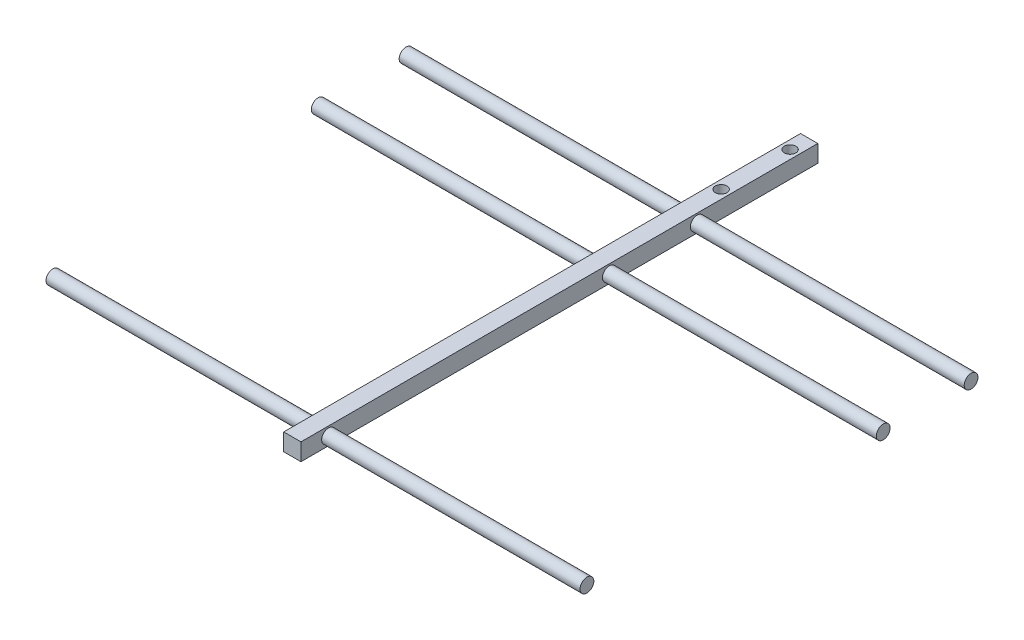
ISO-10303-21;
HEADER;
FILE_DESCRIPTION(('STEP AP214'),'2;1');
FILE_NAME('part.step','',(''),(''),'','','');
FILE_SCHEMA(('AUTOMOTIVE_DESIGN { 1 0 10303 214 1 1 1 1 }'));
ENDSEC;
DATA;
#1=APPLICATION_CONTEXT('core data for automotive mechanical design processes');
#2=APPLICATION_PROTOCOL_DEFINITION('international standard','automotive_design',2000,#1);
#3=PRODUCT_CONTEXT('',#1,'mechanical');
#4=PRODUCT('Part','Part','',(#3));
#5=PRODUCT_RELATED_PRODUCT_CATEGORY('part','',(#4));
#6=PRODUCT_DEFINITION_FORMATION('','',#4);
#7=PRODUCT_DEFINITION_CONTEXT('part definition',#1,'design');
#8=PRODUCT_DEFINITION('design','',#6,#7);
#9=PRODUCT_DEFINITION_SHAPE('','',#8);
#10=(LENGTH_UNIT() NAMED_UNIT(*) SI_UNIT(.MILLI.,.METRE.));
#11=(NAMED_UNIT(*) PLANE_ANGLE_UNIT() SI_UNIT($,.RADIAN.));
#12=(NAMED_UNIT(*) SI_UNIT($,.STERADIAN.) SOLID_ANGLE_UNIT());
#13=UNCERTAINTY_MEASURE_WITH_UNIT(LENGTH_MEASURE(1.E-05),#10,'distance_accuracy_value','');
#14=(GEOMETRIC_REPRESENTATION_CONTEXT(3) GLOBAL_UNCERTAINTY_ASSIGNED_CONTEXT((#13)) GLOBAL_UNIT_ASSIGNED_CONTEXT((#10,
#11,#12)) REPRESENTATION_CONTEXT('',''));
#15=CARTESIAN_POINT('',(0.,0.,0.));
#16=DIRECTION('',(0.,0.,1.));
#17=DIRECTION('',(1.,0.,0.));
#18=AXIS2_PLACEMENT_3D('',#15,#16,#17);
#19=CARTESIAN_POINT('',(5.,5.,300.));
#20=DIRECTION('',(-1.,0.,0.));
#21=DIRECTION('',(0.,-1.,0.));
#22=AXIS2_PLACEMENT_3D('',#19,#20,#21);
#23=PLANE('',#22);
#24=CARTESIAN_POINT('',(5.,0.,121.));
#25=DIRECTION('',(-1.,0.,0.));
#26=DIRECTION('',(0.,-1.,0.));
#27=AXIS2_PLACEMENT_3D('',#24,#25,#26);
#28=CIRCLE('',#27,3.99999999999999);
#29=CARTESIAN_POINT('',(5.,-3.99999999999999,121.));
#30=VERTEX_POINT('',#29);
#31=EDGE_CURVE('E171',#30,#30,#28,.T.);
#32=ORIENTED_EDGE('',*,*,#31,.T.);
#33=EDGE_LOOP('',(#32));
#34=FACE_BOUND('',#33,.T.);
#35=CARTESIAN_POINT('',(5.,0.,70.));
#36=DIRECTION('',(-1.,0.,0.));
#37=DIRECTION('',(0.,-1.,0.));
#38=AXIS2_PLACEMENT_3D('',#35,#36,#37);
#39=CIRCLE('',#38,3.99999999999999);
#40=CARTESIAN_POINT('',(5.,-3.99999999999999,70.));
#41=VERTEX_POINT('',#40);
#42=EDGE_CURVE('E157',#41,#41,#39,.T.);
#43=ORIENTED_EDGE('',*,*,#42,.T.);
#44=EDGE_LOOP('',(#43));
#45=FACE_BOUND('',#44,.T.);
#46=CARTESIAN_POINT('',(5.,0.,284.));
#47=DIRECTION('',(-1.,0.,0.));
#48=DIRECTION('',(0.,-1.,0.));
#49=AXIS2_PLACEMENT_3D('',#46,#47,#48);
#50=CIRCLE('',#49,3.99999999999999);
#51=CARTESIAN_POINT('',(5.,-3.99999999999999,284.));
#52=VERTEX_POINT('',#51);
#53=EDGE_CURVE('E152',#52,#52,#50,.T.);
#54=ORIENTED_EDGE('',*,*,#53,.T.);
#55=EDGE_LOOP('',(#54));
#56=FACE_BOUND('',#55,.T.);
#57=DIRECTION('',(0.,1.,0.));
#58=VECTOR('',#57,1.);
#59=CARTESIAN_POINT('',(5.,5.,0.));
#60=LINE('',#59,#58);
#61=CARTESIAN_POINT('',(5.,-5.,0.));
#62=VERTEX_POINT('',#61);
#63=CARTESIAN_POINT('',(5.,5.,0.));
#64=VERTEX_POINT('',#63);
#65=EDGE_CURVE('E139',#62,#64,#60,.T.);
#66=ORIENTED_EDGE('',*,*,#65,.T.);
#67=DIRECTION('',(0.,0.,-1.));
#68=VECTOR('',#67,1.);
#69=CARTESIAN_POINT('',(5.,5.,300.));
#70=LINE('',#69,#68);
#71=CARTESIAN_POINT('',(5.,5.,300.));
#72=VERTEX_POINT('',#71);
#73=EDGE_CURVE('E12',#72,#64,#70,.T.);
#74=ORIENTED_EDGE('',*,*,#73,.F.);
#75=DIRECTION('',(0.,1.,0.));
#76=VECTOR('',#75,1.);
#77=CARTESIAN_POINT('',(5.,5.,300.));
#78=LINE('',#77,#76);
#79=CARTESIAN_POINT('',(5.,-5.,300.));
#80=VERTEX_POINT('',#79);
#81=EDGE_CURVE('E122',#80,#72,#78,.T.);
#82=ORIENTED_EDGE('',*,*,#81,.F.);
#83=DIRECTION('',(0.,0.,-1.));
#84=VECTOR('',#83,1.);
#85=CARTESIAN_POINT('',(5.,-5.,300.));
#86=LINE('',#85,#84);
#87=EDGE_CURVE('E135',#80,#62,#86,.T.);
#88=ORIENTED_EDGE('',*,*,#87,.T.);
#89=EDGE_LOOP('',(#66,#74,#82,#88));
#90=FACE_BOUND('',#89,.T.);
#91=ADVANCED_FACE('F67',(#34,#45,#56,#90),#23,.F.);
#92=CARTESIAN_POINT('',(-5.,5.,300.));
#93=DIRECTION('',(0.,-1.,0.));
#94=DIRECTION('',(0.,0.,-1.));
#95=AXIS2_PLACEMENT_3D('',#92,#93,#94);
#96=PLANE('',#95);
#97=CARTESIAN_POINT('',(0.,5.,11.0992859871809));
#98=DIRECTION('',(0.,1.,0.));
#99=DIRECTION('',(0.,0.,1.));
#100=AXIS2_PLACEMENT_3D('',#97,#98,#99);
#101=CIRCLE('',#100,3.3845432235855);
#102=CARTESIAN_POINT('',(0.,5.,14.4838292107664));
#103=VERTEX_POINT('',#102);
#104=EDGE_CURVE('E185',#103,#103,#101,.T.);
#105=ORIENTED_EDGE('',*,*,#104,.F.);
#106=EDGE_LOOP('',(#105));
#107=FACE_BOUND('',#106,.T.);
#108=CARTESIAN_POINT('',(0.,5.,51.0992859871809));
#109=DIRECTION('',(0.,1.,0.));
#110=DIRECTION('',(0.,0.,1.));
#111=AXIS2_PLACEMENT_3D('',#108,#109,#110);
#112=CIRCLE('',#111,3.3845432235855);
#113=CARTESIAN_POINT('',(0.,5.,54.4838292107664));
#114=VERTEX_POINT('',#113);
#115=EDGE_CURVE('E188',#114,#114,#112,.T.);
#116=ORIENTED_EDGE('',*,*,#115,.F.);
#117=EDGE_LOOP('',(#116));
#118=FACE_BOUND('',#117,.T.);
#119=DIRECTION('',(-1.,0.,0.));
#120=VECTOR('',#119,1.);
#121=CARTESIAN_POINT('',(-5.,5.,0.));
#122=LINE('',#121,#120);
#123=CARTESIAN_POINT('',(-5.,5.,0.));
#124=VERTEX_POINT('',#123);
#125=EDGE_CURVE('E126',#64,#124,#122,.T.);
#126=ORIENTED_EDGE('',*,*,#125,.T.);
#127=DIRECTION('',(0.,0.,-1.));
#128=VECTOR('',#127,1.);
#129=CARTESIAN_POINT('',(-5.,5.,300.));
#130=LINE('',#129,#128);
#131=CARTESIAN_POINT('',(-5.,5.,300.));
#132=VERTEX_POINT('',#131);
#133=EDGE_CURVE('E77',#132,#124,#130,.T.);
#134=ORIENTED_EDGE('',*,*,#133,.F.);
#135=DIRECTION('',(-1.,0.,0.));
#136=VECTOR('',#135,1.);
#137=CARTESIAN_POINT('',(-5.,5.,300.));
#138=LINE('',#137,#136);
#139=EDGE_CURVE('E117',#72,#132,#138,.T.);
#140=ORIENTED_EDGE('',*,*,#139,.F.);
#141=ORIENTED_EDGE('',*,*,#73,.T.);
#142=EDGE_LOOP('',(#126,#134,#140,#141));
#143=FACE_BOUND('',#142,.T.);
#144=ADVANCED_FACE('F125',(#107,#118,#143),#96,.F.);
#145=CARTESIAN_POINT('',(-5.,5.,300.));
#146=DIRECTION('',(1.,0.,0.));
#147=DIRECTION('',(0.,0.,-1.));
#148=AXIS2_PLACEMENT_3D('',#145,#146,#147);
#149=PLANE('',#148);
#150=CARTESIAN_POINT('',(-5.,0.,121.));
#151=DIRECTION('',(1.,0.,0.));
#152=DIRECTION('',(0.,0.,-1.));
#153=AXIS2_PLACEMENT_3D('',#150,#151,#152);
#154=CIRCLE('',#153,3.99999999999999);
#155=CARTESIAN_POINT('',(-5.,0.,117.));
#156=VERTEX_POINT('',#155);
#157=EDGE_CURVE('E70',#156,#156,#154,.T.);
#158=ORIENTED_EDGE('',*,*,#157,.T.);
#159=EDGE_LOOP('',(#158));
#160=FACE_BOUND('',#159,.T.);
#161=CARTESIAN_POINT('',(-5.,0.,70.));
#162=DIRECTION('',(1.,0.,0.));
#163=DIRECTION('',(0.,0.,-1.));
#164=AXIS2_PLACEMENT_3D('',#161,#162,#163);
#165=CIRCLE('',#164,3.99999999999999);
#166=CARTESIAN_POINT('',(-5.,0.,66.));
#167=VERTEX_POINT('',#166);
#168=EDGE_CURVE('E154',#167,#167,#165,.T.);
#169=ORIENTED_EDGE('',*,*,#168,.T.);
#170=EDGE_LOOP('',(#169));
#171=FACE_BOUND('',#170,.T.);
#172=CARTESIAN_POINT('',(-5.,0.,284.));
#173=DIRECTION('',(1.,0.,0.));
#174=DIRECTION('',(0.,0.,-1.));
#175=AXIS2_PLACEMENT_3D('',#172,#173,#174);
#176=CIRCLE('',#175,3.99999999999999);
#177=CARTESIAN_POINT('',(-5.,0.,280.));
#178=VERTEX_POINT('',#177);
#179=EDGE_CURVE('E150',#178,#178,#176,.T.);
#180=ORIENTED_EDGE('',*,*,#179,.T.);
#181=EDGE_LOOP('',(#180));
#182=FACE_BOUND('',#181,.T.);
#183=DIRECTION('',(0.,-1.,0.));
#184=VECTOR('',#183,1.);
#185=CARTESIAN_POINT('',(-5.,5.,0.));
#186=LINE('',#185,#184);
#187=CARTESIAN_POINT('',(-5.,-5.,0.));
#188=VERTEX_POINT('',#187);
#189=EDGE_CURVE('E104',#124,#188,#186,.T.);
#190=ORIENTED_EDGE('',*,*,#189,.T.);
#191=DIRECTION('',(0.,0.,-1.));
#192=VECTOR('',#191,1.);
#193=CARTESIAN_POINT('',(-5.,-5.,300.));
#194=LINE('',#193,#192);
#195=CARTESIAN_POINT('',(-5.,-5.,300.));
#196=VERTEX_POINT('',#195);
#197=EDGE_CURVE('E128',#196,#188,#194,.T.);
#198=ORIENTED_EDGE('',*,*,#197,.F.);
#199=DIRECTION('',(0.,-1.,0.));
#200=VECTOR('',#199,1.);
#201=CARTESIAN_POINT('',(-5.,5.,300.));
#202=LINE('',#201,#200);
#203=EDGE_CURVE('E120',#132,#196,#202,.T.);
#204=ORIENTED_EDGE('',*,*,#203,.F.);
#205=ORIENTED_EDGE('',*,*,#133,.T.);
#206=EDGE_LOOP('',(#190,#198,#204,#205));
#207=FACE_BOUND('',#206,.T.);
#208=ADVANCED_FACE('F130',(#160,#171,#182,#207),#149,.F.);
#209=CARTESIAN_POINT('',(-5.,-5.,300.));
#210=DIRECTION('',(0.,1.,0.));
#211=DIRECTION('',(0.,0.,1.));
#212=AXIS2_PLACEMENT_3D('',#209,#210,#211);
#213=PLANE('',#212);
#214=CARTESIAN_POINT('',(0.,-5.,11.0992859871809));
#215=DIRECTION('',(0.,1.,0.));
#216=DIRECTION('',(0.,0.,1.));
#217=AXIS2_PLACEMENT_3D('',#214,#215,#216);
#218=CIRCLE('',#217,3.3845432235855);
#219=CARTESIAN_POINT('',(0.,-5.,14.4838292107664));
#220=VERTEX_POINT('',#219);
#221=EDGE_CURVE('E142',#220,#220,#218,.T.);
#222=ORIENTED_EDGE('',*,*,#221,.T.);
#223=EDGE_LOOP('',(#222));
#224=FACE_BOUND('',#223,.T.);
#225=CARTESIAN_POINT('',(0.,-5.,51.0992859871809));
#226=DIRECTION('',(0.,1.,0.));
#227=DIRECTION('',(0.,0.,1.));
#228=AXIS2_PLACEMENT_3D('',#225,#226,#227);
#229=CIRCLE('',#228,3.3845432235855);
#230=CARTESIAN_POINT('',(0.,-5.,54.4838292107664));
#231=VERTEX_POINT('',#230);
#232=EDGE_CURVE('E182',#231,#231,#229,.T.);
#233=ORIENTED_EDGE('',*,*,#232,.T.);
#234=EDGE_LOOP('',(#233));
#235=FACE_BOUND('',#234,.T.);
#236=DIRECTION('',(1.,0.,0.));
#237=VECTOR('',#236,1.);
#238=CARTESIAN_POINT('',(-5.,-5.,0.));
#239=LINE('',#238,#237);
#240=EDGE_CURVE('E110',#188,#62,#239,.T.);
#241=ORIENTED_EDGE('',*,*,#240,.T.);
#242=ORIENTED_EDGE('',*,*,#87,.F.);
#243=DIRECTION('',(1.,0.,0.));
#244=VECTOR('',#243,1.);
#245=CARTESIAN_POINT('',(-5.,-5.,300.));
#246=LINE('',#245,#244);
#247=EDGE_CURVE('E86',#196,#80,#246,.T.);
#248=ORIENTED_EDGE('',*,*,#247,.F.);
#249=ORIENTED_EDGE('',*,*,#197,.T.);
#250=EDGE_LOOP('',(#241,#242,#248,#249));
#251=FACE_BOUND('',#250,.T.);
#252=ADVANCED_FACE('F195',(#224,#235,#251),#213,.F.);
#253=CARTESIAN_POINT('',(0.,0.,300.));
#254=DIRECTION('',(0.,0.,1.));
#255=DIRECTION('',(1.,0.,0.));
#256=AXIS2_PLACEMENT_3D('',#253,#254,#255);
#257=PLANE('',#256);
#258=ORIENTED_EDGE('',*,*,#81,.T.);
#259=ORIENTED_EDGE('',*,*,#139,.T.);
#260=ORIENTED_EDGE('',*,*,#203,.T.);
#261=ORIENTED_EDGE('',*,*,#247,.T.);
#262=EDGE_LOOP('',(#258,#259,#260,#261));
#263=FACE_BOUND('',#262,.T.);
#264=ADVANCED_FACE('F118',(#263),#257,.T.);
#265=CARTESIAN_POINT('',(0.,0.,0.));
#266=DIRECTION('',(0.,0.,1.));
#267=DIRECTION('',(1.,0.,0.));
#268=AXIS2_PLACEMENT_3D('',#265,#266,#267);
#269=PLANE('',#268);
#270=ORIENTED_EDGE('',*,*,#65,.F.);
#271=ORIENTED_EDGE('',*,*,#240,.F.);
#272=ORIENTED_EDGE('',*,*,#189,.F.);
#273=ORIENTED_EDGE('',*,*,#125,.F.);
#274=EDGE_LOOP('',(#270,#271,#272,#273));
#275=FACE_BOUND('',#274,.T.);
#276=ADVANCED_FACE('F201',(#275),#269,.F.);
#277=CARTESIAN_POINT('',(0.,-5.,51.0992859871809));
#278=DIRECTION('',(0.,1.,0.));
#279=DIRECTION('',(0.,0.,1.));
#280=AXIS2_PLACEMENT_3D('',#277,#278,#279);
#281=CYLINDRICAL_SURFACE('',#280,3.3845432235855);
#282=ORIENTED_EDGE('',*,*,#232,.F.);
#283=EDGE_LOOP('',(#282));
#284=FACE_BOUND('',#283,.T.);
#285=ORIENTED_EDGE('',*,*,#115,.T.);
#286=EDGE_LOOP('',(#285));
#287=FACE_BOUND('',#286,.T.);
#288=ADVANCED_FACE('F197',(#284,#287),#281,.F.);
#289=CARTESIAN_POINT('',(0.,-5.,11.0992859871809));
#290=DIRECTION('',(0.,1.,0.));
#291=DIRECTION('',(0.,0.,1.));
#292=AXIS2_PLACEMENT_3D('',#289,#290,#291);
#293=CYLINDRICAL_SURFACE('',#292,3.3845432235855);
#294=ORIENTED_EDGE('',*,*,#221,.F.);
#295=EDGE_LOOP('',(#294));
#296=FACE_BOUND('',#295,.T.);
#297=ORIENTED_EDGE('',*,*,#104,.T.);
#298=EDGE_LOOP('',(#297));
#299=FACE_BOUND('',#298,.T.);
#300=ADVANCED_FACE('F200',(#296,#299),#293,.F.);
#301=CARTESIAN_POINT('',(-155.,0.,0.));
#302=DIRECTION('',(1.,0.,0.));
#303=DIRECTION('',(0.,0.,-1.));
#304=AXIS2_PLACEMENT_3D('',#301,#302,#303);
#305=PLANE('',#304);
#306=CARTESIAN_POINT('',(-155.,0.,284.));
#307=DIRECTION('',(1.,0.,0.));
#308=DIRECTION('',(0.,0.,-1.));
#309=AXIS2_PLACEMENT_3D('',#306,#307,#308);
#310=CIRCLE('',#309,3.99999999999999);
#311=CARTESIAN_POINT('',(-155.,0.,280.));
#312=VERTEX_POINT('',#311);
#313=EDGE_CURVE('E153',#312,#312,#310,.T.);
#314=ORIENTED_EDGE('',*,*,#313,.F.);
#315=EDGE_LOOP('',(#314));
#316=FACE_BOUND('',#315,.T.);
#317=ADVANCED_FACE('F227',(#316),#305,.F.);
#318=CARTESIAN_POINT('',(-155.,0.,284.));
#319=DIRECTION('',(1.,0.,0.));
#320=DIRECTION('',(0.,0.,-1.));
#321=AXIS2_PLACEMENT_3D('',#318,#319,#320);
#322=CYLINDRICAL_SURFACE('',#321,3.99999999999999);
#323=ORIENTED_EDGE('',*,*,#313,.T.);
#324=EDGE_LOOP('',(#323));
#325=FACE_BOUND('',#324,.T.);
#326=ORIENTED_EDGE('',*,*,#179,.F.);
#327=EDGE_LOOP('',(#326));
#328=FACE_BOUND('',#327,.T.);
#329=ADVANCED_FACE('F233',(#325,#328),#322,.T.);
#330=CARTESIAN_POINT('',(155.,0.,284.));
#331=DIRECTION('',(1.,0.,0.));
#332=DIRECTION('',(0.,0.,-1.));
#333=AXIS2_PLACEMENT_3D('',#330,#331,#332);
#334=CIRCLE('',#333,3.99999999999999);
#335=CARTESIAN_POINT('',(155.,0.,280.));
#336=VERTEX_POINT('',#335);
#337=EDGE_CURVE('E163',#336,#336,#334,.T.);
#338=ORIENTED_EDGE('',*,*,#337,.F.);
#339=EDGE_LOOP('',(#338));
#340=FACE_BOUND('',#339,.T.);
#341=ORIENTED_EDGE('',*,*,#53,.F.);
#342=EDGE_LOOP('',(#341));
#343=FACE_BOUND('',#342,.T.);
#344=ADVANCED_FACE('F229',(#340,#343),#322,.T.);
#345=CARTESIAN_POINT('',(155.,0.,0.));
#346=DIRECTION('',(1.,0.,0.));
#347=DIRECTION('',(0.,0.,-1.));
#348=AXIS2_PLACEMENT_3D('',#345,#346,#347);
#349=PLANE('',#348);
#350=ORIENTED_EDGE('',*,*,#337,.T.);
#351=EDGE_LOOP('',(#350));
#352=FACE_BOUND('',#351,.T.);
#353=ADVANCED_FACE('F232',(#352),#349,.T.);
#354=CARTESIAN_POINT('',(-164.,0.,0.));
#355=DIRECTION('',(1.,0.,0.));
#356=DIRECTION('',(0.,0.,-1.));
#357=AXIS2_PLACEMENT_3D('',#354,#355,#356);
#358=PLANE('',#357);
#359=CARTESIAN_POINT('',(-164.,0.,70.));
#360=DIRECTION('',(1.,0.,0.));
#361=DIRECTION('',(0.,0.,-1.));
#362=AXIS2_PLACEMENT_3D('',#359,#360,#361);
#363=CIRCLE('',#362,3.99999999999999);
#364=CARTESIAN_POINT('',(-164.,0.,66.));
#365=VERTEX_POINT('',#364);
#366=EDGE_CURVE('E158',#365,#365,#363,.T.);
#367=ORIENTED_EDGE('',*,*,#366,.F.);
#368=EDGE_LOOP('',(#367));
#369=FACE_BOUND('',#368,.T.);
#370=ADVANCED_FACE('F240',(#369),#358,.F.);
#371=CARTESIAN_POINT('',(-164.,0.,70.));
#372=DIRECTION('',(1.,0.,0.));
#373=DIRECTION('',(0.,0.,-1.));
#374=AXIS2_PLACEMENT_3D('',#371,#372,#373);
#375=CYLINDRICAL_SURFACE('',#374,3.99999999999999);
#376=ORIENTED_EDGE('',*,*,#366,.T.);
#377=EDGE_LOOP('',(#376));
#378=FACE_BOUND('',#377,.T.);
#379=ORIENTED_EDGE('',*,*,#168,.F.);
#380=EDGE_LOOP('',(#379));
#381=FACE_BOUND('',#380,.T.);
#382=ADVANCED_FACE('F246',(#378,#381),#375,.T.);
#383=CARTESIAN_POINT('',(164.,0.,70.));
#384=DIRECTION('',(1.,0.,0.));
#385=DIRECTION('',(0.,0.,-1.));
#386=AXIS2_PLACEMENT_3D('',#383,#384,#385);
#387=CIRCLE('',#386,3.99999999999999);
#388=CARTESIAN_POINT('',(164.,0.,66.));
#389=VERTEX_POINT('',#388);
#390=EDGE_CURVE('E166',#389,#389,#387,.T.);
#391=ORIENTED_EDGE('',*,*,#390,.F.);
#392=EDGE_LOOP('',(#391));
#393=FACE_BOUND('',#392,.T.);
#394=ORIENTED_EDGE('',*,*,#42,.F.);
#395=EDGE_LOOP('',(#394));
#396=FACE_BOUND('',#395,.T.);
#397=ADVANCED_FACE('F242',(#393,#396),#375,.T.);
#398=CARTESIAN_POINT('',(164.,0.,0.));
#399=DIRECTION('',(1.,0.,0.));
#400=DIRECTION('',(0.,0.,-1.));
#401=AXIS2_PLACEMENT_3D('',#398,#399,#400);
#402=PLANE('',#401);
#403=ORIENTED_EDGE('',*,*,#390,.T.);
#404=EDGE_LOOP('',(#403));
#405=FACE_BOUND('',#404,.T.);
#406=ADVANCED_FACE('F245',(#405),#402,.T.);
#407=CARTESIAN_POINT('',(-164.,0.,0.));
#408=DIRECTION('',(1.,0.,0.));
#409=DIRECTION('',(0.,0.,-1.));
#410=AXIS2_PLACEMENT_3D('',#407,#408,#409);
#411=PLANE('',#410);
#412=CARTESIAN_POINT('',(-164.,0.,121.));
#413=DIRECTION('',(1.,0.,0.));
#414=DIRECTION('',(0.,0.,-1.));
#415=AXIS2_PLACEMENT_3D('',#412,#413,#414);
#416=CIRCLE('',#415,3.99999999999999);
#417=CARTESIAN_POINT('',(-164.,0.,117.));
#418=VERTEX_POINT('',#417);
#419=EDGE_CURVE('E271',#418,#418,#416,.T.);
#420=ORIENTED_EDGE('',*,*,#419,.F.);
#421=EDGE_LOOP('',(#420));
#422=FACE_BOUND('',#421,.T.);
#423=ADVANCED_FACE('F253',(#422),#411,.F.);
#424=CARTESIAN_POINT('',(-164.,0.,121.));
#425=DIRECTION('',(1.,0.,0.));
#426=DIRECTION('',(0.,0.,-1.));
#427=AXIS2_PLACEMENT_3D('',#424,#425,#426);
#428=CYLINDRICAL_SURFACE('',#427,3.99999999999999);
#429=ORIENTED_EDGE('',*,*,#419,.T.);
#430=EDGE_LOOP('',(#429));
#431=FACE_BOUND('',#430,.T.);
#432=ORIENTED_EDGE('',*,*,#157,.F.);
#433=EDGE_LOOP('',(#432));
#434=FACE_BOUND('',#433,.T.);
#435=ADVANCED_FACE('F259',(#431,#434),#428,.T.);
#436=CARTESIAN_POINT('',(164.,0.,121.));
#437=DIRECTION('',(1.,0.,0.));
#438=DIRECTION('',(0.,0.,-1.));
#439=AXIS2_PLACEMENT_3D('',#436,#437,#438);
#440=CIRCLE('',#439,3.99999999999999);
#441=CARTESIAN_POINT('',(164.,0.,117.));
#442=VERTEX_POINT('',#441);
#443=EDGE_CURVE('E270',#442,#442,#440,.T.);
#444=ORIENTED_EDGE('',*,*,#443,.F.);
#445=EDGE_LOOP('',(#444));
#446=FACE_BOUND('',#445,.T.);
#447=ORIENTED_EDGE('',*,*,#31,.F.);
#448=EDGE_LOOP('',(#447));
#449=FACE_BOUND('',#448,.T.);
#450=ADVANCED_FACE('F255',(#446,#449),#428,.T.);
#451=CARTESIAN_POINT('',(164.,0.,0.));
#452=DIRECTION('',(1.,0.,0.));
#453=DIRECTION('',(0.,0.,-1.));
#454=AXIS2_PLACEMENT_3D('',#451,#452,#453);
#455=PLANE('',#454);
#456=ORIENTED_EDGE('',*,*,#443,.T.);
#457=EDGE_LOOP('',(#456));
#458=FACE_BOUND('',#457,.T.);
#459=ADVANCED_FACE('F258',(#458),#455,.T.);
#460=CLOSED_SHELL('',(#91,#144,#208,#252,#264,#276,#288,#300,#317,#329,#344,#353,#370,#382,#397,
#406,#423,#435,#450,#459));
#461=MANIFOLD_SOLID_BREP('B2',#460);
#462=ADVANCED_BREP_SHAPE_REPRESENTATION('',(#18,#461),#14);
#463=SHAPE_DEFINITION_REPRESENTATION(#9,#462);
ENDSEC;
END-ISO-10303-21;
